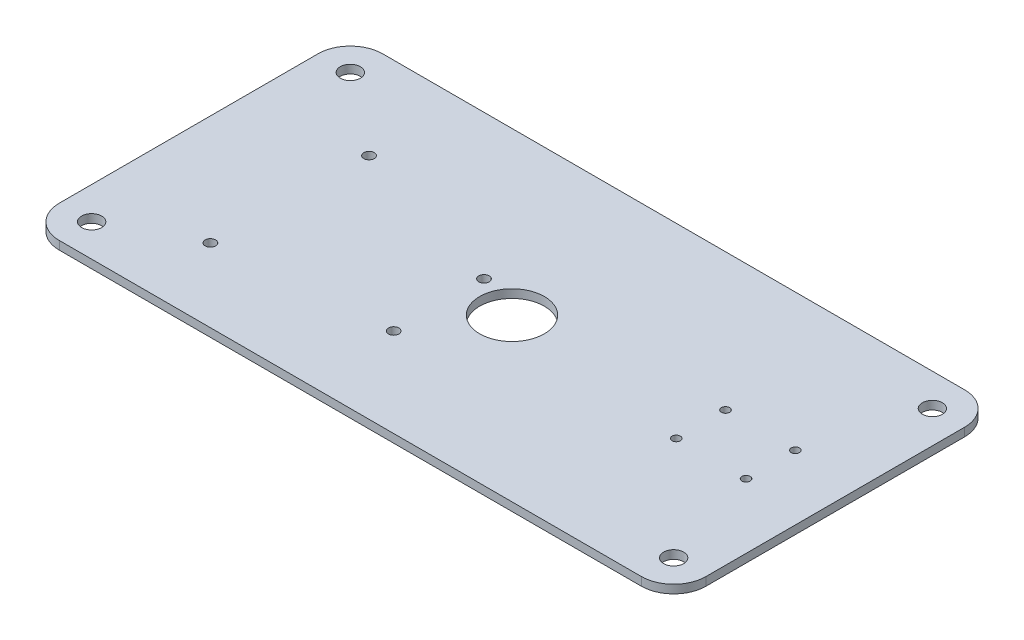
ISO-10303-21;
HEADER;
FILE_DESCRIPTION(('STEP AP214'),'2;1');
FILE_NAME('part.step','',(''),(''),'','','');
FILE_SCHEMA(('AUTOMOTIVE_DESIGN { 1 0 10303 214 1 1 1 1 }'));
ENDSEC;
DATA;
#1=APPLICATION_CONTEXT('core data for automotive mechanical design processes');
#2=APPLICATION_PROTOCOL_DEFINITION('international standard','automotive_design',2000,#1);
#3=PRODUCT_CONTEXT('',#1,'mechanical');
#4=PRODUCT('Part','Part','',(#3));
#5=PRODUCT_RELATED_PRODUCT_CATEGORY('part','',(#4));
#6=PRODUCT_DEFINITION_FORMATION('','',#4);
#7=PRODUCT_DEFINITION_CONTEXT('part definition',#1,'design');
#8=PRODUCT_DEFINITION('design','',#6,#7);
#9=PRODUCT_DEFINITION_SHAPE('','',#8);
#10=(LENGTH_UNIT() NAMED_UNIT(*) SI_UNIT(.MILLI.,.METRE.));
#11=(NAMED_UNIT(*) PLANE_ANGLE_UNIT() SI_UNIT($,.RADIAN.));
#12=(NAMED_UNIT(*) SI_UNIT($,.STERADIAN.) SOLID_ANGLE_UNIT());
#13=UNCERTAINTY_MEASURE_WITH_UNIT(LENGTH_MEASURE(1.E-05),#10,'distance_accuracy_value','');
#14=(GEOMETRIC_REPRESENTATION_CONTEXT(3) GLOBAL_UNCERTAINTY_ASSIGNED_CONTEXT((#13)) GLOBAL_UNIT_ASSIGNED_CONTEXT((#10,
#11,#12)) REPRESENTATION_CONTEXT('',''));
#15=CARTESIAN_POINT('',(0.,0.,0.));
#16=DIRECTION('',(0.,0.,1.));
#17=DIRECTION('',(1.,0.,0.));
#18=AXIS2_PLACEMENT_3D('',#15,#16,#17);
#19=CARTESIAN_POINT('',(0.,2.6,0.));
#20=DIRECTION('',(1.,0.,0.));
#21=DIRECTION('',(0.,0.,-1.));
#22=AXIS2_PLACEMENT_3D('',#19,#20,#21);
#23=PLANE('',#22);
#24=DIRECTION('',(0.,0.,1.));
#25=VECTOR('',#24,1.);
#26=CARTESIAN_POINT('',(0.,2.6,0.));
#27=LINE('',#26,#25);
#28=CARTESIAN_POINT('',(0.,2.6,10.));
#29=VERTEX_POINT('',#28);
#30=CARTESIAN_POINT('',(0.,2.6,90.));
#31=VERTEX_POINT('',#30);
#32=EDGE_CURVE('E121',#29,#31,#27,.T.);
#33=ORIENTED_EDGE('',*,*,#32,.F.);
#34=DIRECTION('',(0.,-1.,0.));
#35=VECTOR('',#34,1.);
#36=CARTESIAN_POINT('',(0.,0.,10.));
#37=LINE('',#36,#35);
#38=CARTESIAN_POINT('',(0.,0.,10.));
#39=VERTEX_POINT('',#38);
#40=EDGE_CURVE('E106',#29,#39,#37,.T.);
#41=ORIENTED_EDGE('',*,*,#40,.T.);
#42=DIRECTION('',(0.,0.,1.));
#43=VECTOR('',#42,1.);
#44=CARTESIAN_POINT('',(0.,0.,0.));
#45=LINE('',#44,#43);
#46=CARTESIAN_POINT('',(0.,0.,90.));
#47=VERTEX_POINT('',#46);
#48=EDGE_CURVE('E118',#39,#47,#45,.T.);
#49=ORIENTED_EDGE('',*,*,#48,.T.);
#50=DIRECTION('',(0.,-1.,0.));
#51=VECTOR('',#50,1.);
#52=CARTESIAN_POINT('',(0.,2.6,90.));
#53=LINE('',#52,#51);
#54=EDGE_CURVE('E123',#47,#31,#53,.F.);
#55=ORIENTED_EDGE('',*,*,#54,.T.);
#56=EDGE_LOOP('',(#33,#41,#49,#55));
#57=FACE_BOUND('',#56,.T.);
#58=ADVANCED_FACE('F35',(#57),#23,.F.);
#59=CARTESIAN_POINT('',(0.,2.6,100.));
#60=DIRECTION('',(0.,0.,-1.));
#61=DIRECTION('',(-1.,0.,0.));
#62=AXIS2_PLACEMENT_3D('',#59,#60,#61);
#63=PLANE('',#62);
#64=DIRECTION('',(1.,0.,0.));
#65=VECTOR('',#64,1.);
#66=CARTESIAN_POINT('',(0.,2.6,100.));
#67=LINE('',#66,#65);
#68=CARTESIAN_POINT('',(10.,2.6,100.));
#69=VERTEX_POINT('',#68);
#70=CARTESIAN_POINT('',(190.,2.6,100.));
#71=VERTEX_POINT('',#70);
#72=EDGE_CURVE('E169',#69,#71,#67,.T.);
#73=ORIENTED_EDGE('',*,*,#72,.F.);
#74=DIRECTION('',(0.,-1.,0.));
#75=VECTOR('',#74,1.);
#76=CARTESIAN_POINT('',(10.,2.6,100.));
#77=LINE('',#76,#75);
#78=CARTESIAN_POINT('',(10.,0.,100.));
#79=VERTEX_POINT('',#78);
#80=EDGE_CURVE('E161',#69,#79,#77,.T.);
#81=ORIENTED_EDGE('',*,*,#80,.T.);
#82=DIRECTION('',(1.,0.,0.));
#83=VECTOR('',#82,1.);
#84=CARTESIAN_POINT('',(0.,0.,100.));
#85=LINE('',#84,#83);
#86=CARTESIAN_POINT('',(190.,0.,100.));
#87=VERTEX_POINT('',#86);
#88=EDGE_CURVE('E127',#79,#87,#85,.T.);
#89=ORIENTED_EDGE('',*,*,#88,.T.);
#90=DIRECTION('',(0.,-1.,0.));
#91=VECTOR('',#90,1.);
#92=CARTESIAN_POINT('',(190.,2.6,100.));
#93=LINE('',#92,#91);
#94=EDGE_CURVE('E159',#87,#71,#93,.F.);
#95=ORIENTED_EDGE('',*,*,#94,.T.);
#96=EDGE_LOOP('',(#73,#81,#89,#95));
#97=FACE_BOUND('',#96,.T.);
#98=ADVANCED_FACE('F167',(#97),#63,.F.);
#99=CARTESIAN_POINT('',(200.,2.6,0.));
#100=DIRECTION('',(1.,0.,0.));
#101=DIRECTION('',(0.,0.,-1.));
#102=AXIS2_PLACEMENT_3D('',#99,#100,#101);
#103=PLANE('',#102);
#104=DIRECTION('',(0.,0.,1.));
#105=VECTOR('',#104,1.);
#106=CARTESIAN_POINT('',(200.,2.6,0.));
#107=LINE('',#106,#105);
#108=CARTESIAN_POINT('',(200.,2.6,10.));
#109=VERTEX_POINT('',#108);
#110=CARTESIAN_POINT('',(200.,2.6,90.));
#111=VERTEX_POINT('',#110);
#112=EDGE_CURVE('E176',#109,#111,#107,.T.);
#113=ORIENTED_EDGE('',*,*,#112,.T.);
#114=DIRECTION('',(0.,-1.,0.));
#115=VECTOR('',#114,1.);
#116=CARTESIAN_POINT('',(200.,0.,90.));
#117=LINE('',#116,#115);
#118=CARTESIAN_POINT('',(200.,0.,90.));
#119=VERTEX_POINT('',#118);
#120=EDGE_CURVE('E11',#111,#119,#117,.T.);
#121=ORIENTED_EDGE('',*,*,#120,.T.);
#122=DIRECTION('',(0.,0.,1.));
#123=VECTOR('',#122,1.);
#124=CARTESIAN_POINT('',(200.,0.,0.));
#125=LINE('',#124,#123);
#126=CARTESIAN_POINT('',(200.,0.,10.));
#127=VERTEX_POINT('',#126);
#128=EDGE_CURVE('E131',#127,#119,#125,.T.);
#129=ORIENTED_EDGE('',*,*,#128,.F.);
#130=DIRECTION('',(0.,-1.,0.));
#131=VECTOR('',#130,1.);
#132=CARTESIAN_POINT('',(200.,2.6,10.));
#133=LINE('',#132,#131);
#134=EDGE_CURVE('E44',#127,#109,#133,.F.);
#135=ORIENTED_EDGE('',*,*,#134,.T.);
#136=EDGE_LOOP('',(#113,#121,#129,#135));
#137=FACE_BOUND('',#136,.T.);
#138=ADVANCED_FACE('F175',(#137),#103,.T.);
#139=CARTESIAN_POINT('',(0.,2.6,0.));
#140=DIRECTION('',(0.,0.,-1.));
#141=DIRECTION('',(-1.,0.,0.));
#142=AXIS2_PLACEMENT_3D('',#139,#140,#141);
#143=PLANE('',#142);
#144=DIRECTION('',(1.,0.,0.));
#145=VECTOR('',#144,1.);
#146=CARTESIAN_POINT('',(0.,0.,0.));
#147=LINE('',#146,#145);
#148=CARTESIAN_POINT('',(10.,0.,0.));
#149=VERTEX_POINT('',#148);
#150=CARTESIAN_POINT('',(190.,0.,0.));
#151=VERTEX_POINT('',#150);
#152=EDGE_CURVE('E142',#149,#151,#147,.T.);
#153=ORIENTED_EDGE('',*,*,#152,.F.);
#154=DIRECTION('',(0.,-1.,0.));
#155=VECTOR('',#154,1.);
#156=CARTESIAN_POINT('',(10.,2.6,0.));
#157=LINE('',#156,#155);
#158=CARTESIAN_POINT('',(10.,2.6,0.));
#159=VERTEX_POINT('',#158);
#160=EDGE_CURVE('E107',#149,#159,#157,.F.);
#161=ORIENTED_EDGE('',*,*,#160,.T.);
#162=DIRECTION('',(1.,0.,0.));
#163=VECTOR('',#162,1.);
#164=CARTESIAN_POINT('',(0.,2.6,0.));
#165=LINE('',#164,#163);
#166=CARTESIAN_POINT('',(190.,2.6,0.));
#167=VERTEX_POINT('',#166);
#168=EDGE_CURVE('E137',#159,#167,#165,.T.);
#169=ORIENTED_EDGE('',*,*,#168,.T.);
#170=DIRECTION('',(0.,-1.,0.));
#171=VECTOR('',#170,1.);
#172=CARTESIAN_POINT('',(190.,2.6,0.));
#173=LINE('',#172,#171);
#174=EDGE_CURVE('E112',#167,#151,#173,.T.);
#175=ORIENTED_EDGE('',*,*,#174,.T.);
#176=EDGE_LOOP('',(#153,#161,#169,#175));
#177=FACE_BOUND('',#176,.T.);
#178=ADVANCED_FACE('F266',(#177),#143,.T.);
#179=CARTESIAN_POINT('',(0.,2.6,0.));
#180=DIRECTION('',(0.,1.,0.));
#181=DIRECTION('',(0.,0.,1.));
#182=AXIS2_PLACEMENT_3D('',#179,#180,#181);
#183=PLANE('',#182);
#184=CARTESIAN_POINT('',(180.,2.6,42.38));
#185=DIRECTION('',(0.,1.,0.));
#186=DIRECTION('',(0.,0.,1.));
#187=AXIS2_PLACEMENT_3D('',#184,#185,#186);
#188=CIRCLE('',#187,1.27);
#189=CARTESIAN_POINT('',(180.,2.6,43.65));
#190=VERTEX_POINT('',#189);
#191=EDGE_CURVE('E248',#190,#190,#188,.T.);
#192=ORIENTED_EDGE('',*,*,#191,.F.);
#193=EDGE_LOOP('',(#192));
#194=FACE_BOUND('',#193,.T.);
#195=CARTESIAN_POINT('',(158.41,2.6,57.62));
#196=DIRECTION('',(0.,1.,0.));
#197=DIRECTION('',(0.,0.,1.));
#198=AXIS2_PLACEMENT_3D('',#195,#196,#197);
#199=CIRCLE('',#198,1.27);
#200=CARTESIAN_POINT('',(158.41,2.6,58.89));
#201=VERTEX_POINT('',#200);
#202=EDGE_CURVE('E242',#201,#201,#199,.T.);
#203=ORIENTED_EDGE('',*,*,#202,.F.);
#204=EDGE_LOOP('',(#203));
#205=FACE_BOUND('',#204,.T.);
#206=CARTESIAN_POINT('',(180.,2.6,57.62));
#207=DIRECTION('',(0.,1.,0.));
#208=DIRECTION('',(0.,0.,1.));
#209=AXIS2_PLACEMENT_3D('',#206,#207,#208);
#210=CIRCLE('',#209,1.27);
#211=CARTESIAN_POINT('',(180.,2.6,58.89));
#212=VERTEX_POINT('',#211);
#213=EDGE_CURVE('E236',#212,#212,#210,.T.);
#214=ORIENTED_EDGE('',*,*,#213,.F.);
#215=EDGE_LOOP('',(#214));
#216=FACE_BOUND('',#215,.T.);
#217=CARTESIAN_POINT('',(158.41,2.6,42.38));
#218=DIRECTION('',(0.,1.,0.));
#219=DIRECTION('',(0.,0.,1.));
#220=AXIS2_PLACEMENT_3D('',#217,#218,#219);
#221=CIRCLE('',#220,1.27);
#222=CARTESIAN_POINT('',(158.41,2.6,43.65));
#223=VERTEX_POINT('',#222);
#224=EDGE_CURVE('E230',#223,#223,#221,.T.);
#225=ORIENTED_EDGE('',*,*,#224,.F.);
#226=EDGE_LOOP('',(#225));
#227=FACE_BOUND('',#226,.T.);
#228=CARTESIAN_POINT('',(100.,2.6,50.));
#229=DIRECTION('',(0.,-1.,0.));
#230=DIRECTION('',(0.,0.,-1.));
#231=AXIS2_PLACEMENT_3D('',#228,#229,#230);
#232=CIRCLE('',#231,9.99999999999999);
#233=CARTESIAN_POINT('',(100.,2.6,40.));
#234=VERTEX_POINT('',#233);
#235=EDGE_CURVE('E221',#234,#234,#232,.T.);
#236=ORIENTED_EDGE('',*,*,#235,.T.);
#237=EDGE_LOOP('',(#236));
#238=FACE_BOUND('',#237,.T.);
#239=CARTESIAN_POINT('',(85.94475,2.6,72.53875));
#240=DIRECTION('',(0.,1.,0.));
#241=DIRECTION('',(0.,0.,1.));
#242=AXIS2_PLACEMENT_3D('',#239,#240,#241);
#243=CIRCLE('',#242,1.61925);
#244=CARTESIAN_POINT('',(85.94475,2.6,74.158));
#245=VERTEX_POINT('',#244);
#246=EDGE_CURVE('E218',#245,#245,#243,.T.);
#247=ORIENTED_EDGE('',*,*,#246,.F.);
#248=EDGE_LOOP('',(#247));
#249=FACE_BOUND('',#248,.T.);
#250=CARTESIAN_POINT('',(34.01445,2.6,77.28855));
#251=DIRECTION('',(0.,1.,0.));
#252=DIRECTION('',(0.,0.,1.));
#253=AXIS2_PLACEMENT_3D('',#250,#251,#252);
#254=CIRCLE('',#253,1.61925);
#255=CARTESIAN_POINT('',(34.01445,2.6,78.9078));
#256=VERTEX_POINT('',#255);
#257=EDGE_CURVE('E212',#256,#256,#254,.T.);
#258=ORIENTED_EDGE('',*,*,#257,.F.);
#259=EDGE_LOOP('',(#258));
#260=FACE_BOUND('',#259,.T.);
#261=CARTESIAN_POINT('',(85.94475,2.6,44.61145));
#262=DIRECTION('',(0.,1.,0.));
#263=DIRECTION('',(0.,0.,1.));
#264=AXIS2_PLACEMENT_3D('',#261,#262,#263);
#265=CIRCLE('',#264,1.61925);
#266=CARTESIAN_POINT('',(85.94475,2.6,46.2307));
#267=VERTEX_POINT('',#266);
#268=EDGE_CURVE('E206',#267,#267,#265,.T.);
#269=ORIENTED_EDGE('',*,*,#268,.F.);
#270=EDGE_LOOP('',(#269));
#271=FACE_BOUND('',#270,.T.);
#272=CARTESIAN_POINT('',(35.15745,2.6,29.37145));
#273=DIRECTION('',(0.,1.,0.));
#274=DIRECTION('',(0.,0.,1.));
#275=AXIS2_PLACEMENT_3D('',#272,#273,#274);
#276=CIRCLE('',#275,1.61924999999999);
#277=CARTESIAN_POINT('',(35.15745,2.6,30.9907));
#278=VERTEX_POINT('',#277);
#279=EDGE_CURVE('E202',#278,#278,#276,.T.);
#280=ORIENTED_EDGE('',*,*,#279,.F.);
#281=EDGE_LOOP('',(#280));
#282=FACE_BOUND('',#281,.T.);
#283=CARTESIAN_POINT('',(190.,2.6,90.));
#284=DIRECTION('',(0.,1.,0.));
#285=DIRECTION('',(0.,0.,1.));
#286=AXIS2_PLACEMENT_3D('',#283,#284,#285);
#287=CIRCLE('',#286,3.09999999999999);
#288=CARTESIAN_POINT('',(190.,2.6,93.1));
#289=VERTEX_POINT('',#288);
#290=EDGE_CURVE('E194',#289,#289,#287,.T.);
#291=ORIENTED_EDGE('',*,*,#290,.F.);
#292=EDGE_LOOP('',(#291));
#293=FACE_BOUND('',#292,.T.);
#294=CARTESIAN_POINT('',(10.,2.6,90.));
#295=DIRECTION('',(0.,-1.,0.));
#296=DIRECTION('',(0.,0.,1.));
#297=AXIS2_PLACEMENT_3D('',#294,#295,#296);
#298=CIRCLE('',#297,3.09999999999999);
#299=CARTESIAN_POINT('',(10.,2.6,93.1));
#300=VERTEX_POINT('',#299);
#301=EDGE_CURVE('E188',#300,#300,#298,.T.);
#302=ORIENTED_EDGE('',*,*,#301,.T.);
#303=EDGE_LOOP('',(#302));
#304=FACE_BOUND('',#303,.T.);
#305=CARTESIAN_POINT('',(10.,2.6,10.));
#306=DIRECTION('',(0.,1.,0.));
#307=DIRECTION('',(0.,0.,-1.));
#308=AXIS2_PLACEMENT_3D('',#305,#306,#307);
#309=CIRCLE('',#308,3.09999999999999);
#310=CARTESIAN_POINT('',(10.,2.6,6.90000000000002));
#311=VERTEX_POINT('',#310);
#312=EDGE_CURVE('E183',#311,#311,#309,.T.);
#313=ORIENTED_EDGE('',*,*,#312,.F.);
#314=EDGE_LOOP('',(#313));
#315=FACE_BOUND('',#314,.T.);
#316=CARTESIAN_POINT('',(190.,2.6,10.));
#317=DIRECTION('',(0.,-1.,0.));
#318=DIRECTION('',(0.,0.,-1.));
#319=AXIS2_PLACEMENT_3D('',#316,#317,#318);
#320=CIRCLE('',#319,3.09999999999999);
#321=CARTESIAN_POINT('',(190.,2.6,6.90000000000001));
#322=VERTEX_POINT('',#321);
#323=EDGE_CURVE('E128',#322,#322,#320,.T.);
#324=ORIENTED_EDGE('',*,*,#323,.T.);
#325=EDGE_LOOP('',(#324));
#326=FACE_BOUND('',#325,.T.);
#327=ORIENTED_EDGE('',*,*,#168,.F.);
#328=CARTESIAN_POINT('',(10.,2.6,10.));
#329=DIRECTION('',(0.,1.,0.));
#330=DIRECTION('',(0.,0.,1.));
#331=AXIS2_PLACEMENT_3D('',#328,#329,#330);
#332=CIRCLE('',#331,10.);
#333=EDGE_CURVE('E157',#159,#29,#332,.T.);
#334=ORIENTED_EDGE('',*,*,#333,.T.);
#335=ORIENTED_EDGE('',*,*,#32,.T.);
#336=CARTESIAN_POINT('',(10.,2.6,90.));
#337=DIRECTION('',(0.,1.,0.));
#338=DIRECTION('',(0.,0.,1.));
#339=AXIS2_PLACEMENT_3D('',#336,#337,#338);
#340=CIRCLE('',#339,10.);
#341=EDGE_CURVE('E155',#31,#69,#340,.T.);
#342=ORIENTED_EDGE('',*,*,#341,.T.);
#343=ORIENTED_EDGE('',*,*,#72,.T.);
#344=CARTESIAN_POINT('',(190.,2.6,90.));
#345=DIRECTION('',(0.,1.,0.));
#346=DIRECTION('',(0.,0.,1.));
#347=AXIS2_PLACEMENT_3D('',#344,#345,#346);
#348=CIRCLE('',#347,10.);
#349=EDGE_CURVE('E51',#71,#111,#348,.T.);
#350=ORIENTED_EDGE('',*,*,#349,.T.);
#351=ORIENTED_EDGE('',*,*,#112,.F.);
#352=CARTESIAN_POINT('',(190.,2.6,10.));
#353=DIRECTION('',(0.,1.,0.));
#354=DIRECTION('',(0.,0.,1.));
#355=AXIS2_PLACEMENT_3D('',#352,#353,#354);
#356=CIRCLE('',#355,10.);
#357=EDGE_CURVE('E152',#109,#167,#356,.T.);
#358=ORIENTED_EDGE('',*,*,#357,.T.);
#359=EDGE_LOOP('',(#327,#334,#335,#342,#343,#350,#351,#358));
#360=FACE_BOUND('',#359,.T.);
#361=ADVANCED_FACE('F263',(#194,#205,#216,#227,#238,#249,#260,#271,#282,#293,#304,#315,#326,
#360),#183,.T.);
#362=CARTESIAN_POINT('',(0.,0.,0.));
#363=DIRECTION('',(0.,1.,0.));
#364=DIRECTION('',(0.,0.,1.));
#365=AXIS2_PLACEMENT_3D('',#362,#363,#364);
#366=PLANE('',#365);
#367=CARTESIAN_POINT('',(180.,0.,42.38));
#368=DIRECTION('',(0.,1.,0.));
#369=DIRECTION('',(0.,0.,1.));
#370=AXIS2_PLACEMENT_3D('',#367,#368,#369);
#371=CIRCLE('',#370,1.27);
#372=CARTESIAN_POINT('',(180.,0.,43.65));
#373=VERTEX_POINT('',#372);
#374=EDGE_CURVE('E233',#373,#373,#371,.T.);
#375=ORIENTED_EDGE('',*,*,#374,.T.);
#376=EDGE_LOOP('',(#375));
#377=FACE_BOUND('',#376,.T.);
#378=CARTESIAN_POINT('',(158.41,0.,57.62));
#379=DIRECTION('',(0.,1.,0.));
#380=DIRECTION('',(0.,0.,1.));
#381=AXIS2_PLACEMENT_3D('',#378,#379,#380);
#382=CIRCLE('',#381,1.27);
#383=CARTESIAN_POINT('',(158.41,0.,58.89));
#384=VERTEX_POINT('',#383);
#385=EDGE_CURVE('E245',#384,#384,#382,.T.);
#386=ORIENTED_EDGE('',*,*,#385,.T.);
#387=EDGE_LOOP('',(#386));
#388=FACE_BOUND('',#387,.T.);
#389=CARTESIAN_POINT('',(180.,0.,57.62));
#390=DIRECTION('',(0.,1.,0.));
#391=DIRECTION('',(0.,0.,1.));
#392=AXIS2_PLACEMENT_3D('',#389,#390,#391);
#393=CIRCLE('',#392,1.27);
#394=CARTESIAN_POINT('',(180.,0.,58.89));
#395=VERTEX_POINT('',#394);
#396=EDGE_CURVE('E239',#395,#395,#393,.T.);
#397=ORIENTED_EDGE('',*,*,#396,.T.);
#398=EDGE_LOOP('',(#397));
#399=FACE_BOUND('',#398,.T.);
#400=CARTESIAN_POINT('',(158.41,0.,42.38));
#401=DIRECTION('',(0.,1.,0.));
#402=DIRECTION('',(0.,0.,1.));
#403=AXIS2_PLACEMENT_3D('',#400,#401,#402);
#404=CIRCLE('',#403,1.27);
#405=CARTESIAN_POINT('',(158.41,0.,43.65));
#406=VERTEX_POINT('',#405);
#407=EDGE_CURVE('E227',#406,#406,#404,.T.);
#408=ORIENTED_EDGE('',*,*,#407,.T.);
#409=EDGE_LOOP('',(#408));
#410=FACE_BOUND('',#409,.T.);
#411=CARTESIAN_POINT('',(100.,0.,50.));
#412=DIRECTION('',(0.,-1.,0.));
#413=DIRECTION('',(0.,0.,-1.));
#414=AXIS2_PLACEMENT_3D('',#411,#412,#413);
#415=CIRCLE('',#414,9.99999999999999);
#416=CARTESIAN_POINT('',(100.,0.,40.));
#417=VERTEX_POINT('',#416);
#418=EDGE_CURVE('E224',#417,#417,#415,.T.);
#419=ORIENTED_EDGE('',*,*,#418,.F.);
#420=EDGE_LOOP('',(#419));
#421=FACE_BOUND('',#420,.T.);
#422=CARTESIAN_POINT('',(85.94475,0.,72.53875));
#423=DIRECTION('',(0.,1.,0.));
#424=DIRECTION('',(0.,0.,1.));
#425=AXIS2_PLACEMENT_3D('',#422,#423,#424);
#426=CIRCLE('',#425,1.61925);
#427=CARTESIAN_POINT('',(85.94475,0.,74.158));
#428=VERTEX_POINT('',#427);
#429=EDGE_CURVE('E215',#428,#428,#426,.T.);
#430=ORIENTED_EDGE('',*,*,#429,.T.);
#431=EDGE_LOOP('',(#430));
#432=FACE_BOUND('',#431,.T.);
#433=CARTESIAN_POINT('',(34.01445,0.,77.28855));
#434=DIRECTION('',(0.,1.,0.));
#435=DIRECTION('',(0.,0.,1.));
#436=AXIS2_PLACEMENT_3D('',#433,#434,#435);
#437=CIRCLE('',#436,1.61925);
#438=CARTESIAN_POINT('',(34.01445,0.,78.9078));
#439=VERTEX_POINT('',#438);
#440=EDGE_CURVE('E209',#439,#439,#437,.T.);
#441=ORIENTED_EDGE('',*,*,#440,.T.);
#442=EDGE_LOOP('',(#441));
#443=FACE_BOUND('',#442,.T.);
#444=CARTESIAN_POINT('',(85.94475,0.,44.61145));
#445=DIRECTION('',(0.,1.,0.));
#446=DIRECTION('',(0.,0.,1.));
#447=AXIS2_PLACEMENT_3D('',#444,#445,#446);
#448=CIRCLE('',#447,1.61925);
#449=CARTESIAN_POINT('',(85.94475,0.,46.2307));
#450=VERTEX_POINT('',#449);
#451=EDGE_CURVE('E205',#450,#450,#448,.T.);
#452=ORIENTED_EDGE('',*,*,#451,.T.);
#453=EDGE_LOOP('',(#452));
#454=FACE_BOUND('',#453,.T.);
#455=CARTESIAN_POINT('',(35.15745,0.,29.37145));
#456=DIRECTION('',(0.,1.,0.));
#457=DIRECTION('',(0.,0.,1.));
#458=AXIS2_PLACEMENT_3D('',#455,#456,#457);
#459=CIRCLE('',#458,1.61924999999999);
#460=CARTESIAN_POINT('',(35.15745,0.,30.9907));
#461=VERTEX_POINT('',#460);
#462=EDGE_CURVE('E39',#461,#461,#459,.T.);
#463=ORIENTED_EDGE('',*,*,#462,.T.);
#464=EDGE_LOOP('',(#463));
#465=FACE_BOUND('',#464,.T.);
#466=CARTESIAN_POINT('',(190.,0.,90.));
#467=DIRECTION('',(0.,1.,0.));
#468=DIRECTION('',(0.,0.,1.));
#469=AXIS2_PLACEMENT_3D('',#466,#467,#468);
#470=CIRCLE('',#469,3.09999999999999);
#471=CARTESIAN_POINT('',(190.,0.,93.1));
#472=VERTEX_POINT('',#471);
#473=EDGE_CURVE('E197',#472,#472,#470,.T.);
#474=ORIENTED_EDGE('',*,*,#473,.T.);
#475=EDGE_LOOP('',(#474));
#476=FACE_BOUND('',#475,.T.);
#477=CARTESIAN_POINT('',(10.,0.,90.));
#478=DIRECTION('',(0.,-1.,0.));
#479=DIRECTION('',(0.,0.,1.));
#480=AXIS2_PLACEMENT_3D('',#477,#478,#479);
#481=CIRCLE('',#480,3.09999999999999);
#482=CARTESIAN_POINT('',(10.,0.,93.1));
#483=VERTEX_POINT('',#482);
#484=EDGE_CURVE('E191',#483,#483,#481,.T.);
#485=ORIENTED_EDGE('',*,*,#484,.F.);
#486=EDGE_LOOP('',(#485));
#487=FACE_BOUND('',#486,.T.);
#488=CARTESIAN_POINT('',(10.,0.,10.));
#489=DIRECTION('',(0.,1.,0.));
#490=DIRECTION('',(0.,0.,-1.));
#491=AXIS2_PLACEMENT_3D('',#488,#489,#490);
#492=CIRCLE('',#491,3.09999999999999);
#493=CARTESIAN_POINT('',(10.,0.,6.90000000000002));
#494=VERTEX_POINT('',#493);
#495=EDGE_CURVE('E185',#494,#494,#492,.T.);
#496=ORIENTED_EDGE('',*,*,#495,.T.);
#497=EDGE_LOOP('',(#496));
#498=FACE_BOUND('',#497,.T.);
#499=CARTESIAN_POINT('',(190.,0.,10.));
#500=DIRECTION('',(0.,-1.,0.));
#501=DIRECTION('',(0.,0.,-1.));
#502=AXIS2_PLACEMENT_3D('',#499,#500,#501);
#503=CIRCLE('',#502,3.09999999999999);
#504=CARTESIAN_POINT('',(190.,0.,6.90000000000001));
#505=VERTEX_POINT('',#504);
#506=EDGE_CURVE('E134',#505,#505,#503,.T.);
#507=ORIENTED_EDGE('',*,*,#506,.F.);
#508=EDGE_LOOP('',(#507));
#509=FACE_BOUND('',#508,.T.);
#510=ORIENTED_EDGE('',*,*,#48,.F.);
#511=CARTESIAN_POINT('',(10.,0.,10.));
#512=DIRECTION('',(0.,1.,0.));
#513=DIRECTION('',(0.,0.,1.));
#514=AXIS2_PLACEMENT_3D('',#511,#512,#513);
#515=CIRCLE('',#514,10.);
#516=EDGE_CURVE('E102',#39,#149,#515,.F.);
#517=ORIENTED_EDGE('',*,*,#516,.T.);
#518=ORIENTED_EDGE('',*,*,#152,.T.);
#519=CARTESIAN_POINT('',(190.,0.,10.));
#520=DIRECTION('',(0.,1.,0.));
#521=DIRECTION('',(0.,0.,1.));
#522=AXIS2_PLACEMENT_3D('',#519,#520,#521);
#523=CIRCLE('',#522,10.);
#524=EDGE_CURVE('E122',#151,#127,#523,.F.);
#525=ORIENTED_EDGE('',*,*,#524,.T.);
#526=ORIENTED_EDGE('',*,*,#128,.T.);
#527=CARTESIAN_POINT('',(190.,0.,90.));
#528=DIRECTION('',(0.,1.,0.));
#529=DIRECTION('',(0.,0.,1.));
#530=AXIS2_PLACEMENT_3D('',#527,#528,#529);
#531=CIRCLE('',#530,10.);
#532=EDGE_CURVE('E146',#119,#87,#531,.F.);
#533=ORIENTED_EDGE('',*,*,#532,.T.);
#534=ORIENTED_EDGE('',*,*,#88,.F.);
#535=CARTESIAN_POINT('',(10.,0.,90.));
#536=DIRECTION('',(0.,1.,0.));
#537=DIRECTION('',(0.,0.,1.));
#538=AXIS2_PLACEMENT_3D('',#535,#536,#537);
#539=CIRCLE('',#538,10.);
#540=EDGE_CURVE('E113',#79,#47,#539,.F.);
#541=ORIENTED_EDGE('',*,*,#540,.T.);
#542=EDGE_LOOP('',(#510,#517,#518,#525,#526,#533,#534,#541));
#543=FACE_BOUND('',#542,.T.);
#544=ADVANCED_FACE('F125',(#377,#388,#399,#410,#421,#432,#443,#454,#465,#476,#487,#498,#509,
#543),#366,.F.);
#545=CARTESIAN_POINT('',(10.,2.6,10.));
#546=DIRECTION('',(0.,1.,0.));
#547=DIRECTION('',(0.,0.,1.));
#548=AXIS2_PLACEMENT_3D('',#545,#546,#547);
#549=CYLINDRICAL_SURFACE('',#548,10.);
#550=ORIENTED_EDGE('',*,*,#333,.F.);
#551=ORIENTED_EDGE('',*,*,#160,.F.);
#552=ORIENTED_EDGE('',*,*,#516,.F.);
#553=ORIENTED_EDGE('',*,*,#40,.F.);
#554=EDGE_LOOP('',(#550,#551,#552,#553));
#555=FACE_BOUND('',#554,.T.);
#556=ADVANCED_FACE('F105',(#555),#549,.T.);
#557=CARTESIAN_POINT('',(10.,2.6,90.));
#558=DIRECTION('',(0.,-1.,0.));
#559=DIRECTION('',(0.,0.,-1.));
#560=AXIS2_PLACEMENT_3D('',#557,#558,#559);
#561=CYLINDRICAL_SURFACE('',#560,10.);
#562=ORIENTED_EDGE('',*,*,#341,.F.);
#563=ORIENTED_EDGE('',*,*,#54,.F.);
#564=ORIENTED_EDGE('',*,*,#540,.F.);
#565=ORIENTED_EDGE('',*,*,#80,.F.);
#566=EDGE_LOOP('',(#562,#563,#564,#565));
#567=FACE_BOUND('',#566,.T.);
#568=ADVANCED_FACE('F304',(#567),#561,.T.);
#569=CARTESIAN_POINT('',(190.,2.6,90.));
#570=DIRECTION('',(0.,1.,0.));
#571=DIRECTION('',(0.,0.,1.));
#572=AXIS2_PLACEMENT_3D('',#569,#570,#571);
#573=CYLINDRICAL_SURFACE('',#572,10.);
#574=ORIENTED_EDGE('',*,*,#349,.F.);
#575=ORIENTED_EDGE('',*,*,#94,.F.);
#576=ORIENTED_EDGE('',*,*,#532,.F.);
#577=ORIENTED_EDGE('',*,*,#120,.F.);
#578=EDGE_LOOP('',(#574,#575,#576,#577));
#579=FACE_BOUND('',#578,.T.);
#580=ADVANCED_FACE('F174',(#579),#573,.T.);
#581=CARTESIAN_POINT('',(190.,2.6,10.));
#582=DIRECTION('',(0.,-1.,0.));
#583=DIRECTION('',(0.,0.,-1.));
#584=AXIS2_PLACEMENT_3D('',#581,#582,#583);
#585=CYLINDRICAL_SURFACE('',#584,10.);
#586=ORIENTED_EDGE('',*,*,#357,.F.);
#587=ORIENTED_EDGE('',*,*,#134,.F.);
#588=ORIENTED_EDGE('',*,*,#524,.F.);
#589=ORIENTED_EDGE('',*,*,#174,.F.);
#590=EDGE_LOOP('',(#586,#587,#588,#589));
#591=FACE_BOUND('',#590,.T.);
#592=ADVANCED_FACE('F37',(#591),#585,.T.);
#593=CARTESIAN_POINT('',(190.,2.6,10.));
#594=DIRECTION('',(0.,-1.,0.));
#595=DIRECTION('',(0.,0.,-1.));
#596=AXIS2_PLACEMENT_3D('',#593,#594,#595);
#597=CYLINDRICAL_SURFACE('',#596,3.09999999999999);
#598=ORIENTED_EDGE('',*,*,#323,.F.);
#599=EDGE_LOOP('',(#598));
#600=FACE_BOUND('',#599,.T.);
#601=ORIENTED_EDGE('',*,*,#506,.T.);
#602=EDGE_LOOP('',(#601));
#603=FACE_BOUND('',#602,.T.);
#604=ADVANCED_FACE('F296',(#600,#603),#597,.F.);
#605=CARTESIAN_POINT('',(10.,2.6,10.));
#606=DIRECTION('',(0.,-1.,0.));
#607=DIRECTION('',(0.,0.,-1.));
#608=AXIS2_PLACEMENT_3D('',#605,#606,#607);
#609=CYLINDRICAL_SURFACE('',#608,3.09999999999999);
#610=ORIENTED_EDGE('',*,*,#312,.T.);
#611=EDGE_LOOP('',(#610));
#612=FACE_BOUND('',#611,.T.);
#613=ORIENTED_EDGE('',*,*,#495,.F.);
#614=EDGE_LOOP('',(#613));
#615=FACE_BOUND('',#614,.T.);
#616=ADVANCED_FACE('F301',(#612,#615),#609,.F.);
#617=CARTESIAN_POINT('',(10.,2.6,90.));
#618=DIRECTION('',(0.,-1.,0.));
#619=DIRECTION('',(0.,0.,-1.));
#620=AXIS2_PLACEMENT_3D('',#617,#618,#619);
#621=CYLINDRICAL_SURFACE('',#620,3.09999999999999);
#622=ORIENTED_EDGE('',*,*,#301,.F.);
#623=EDGE_LOOP('',(#622));
#624=FACE_BOUND('',#623,.T.);
#625=ORIENTED_EDGE('',*,*,#484,.T.);
#626=EDGE_LOOP('',(#625));
#627=FACE_BOUND('',#626,.T.);
#628=ADVANCED_FACE('F344',(#624,#627),#621,.F.);
#629=CARTESIAN_POINT('',(190.,2.6,90.));
#630=DIRECTION('',(0.,-1.,0.));
#631=DIRECTION('',(0.,0.,-1.));
#632=AXIS2_PLACEMENT_3D('',#629,#630,#631);
#633=CYLINDRICAL_SURFACE('',#632,3.09999999999999);
#634=ORIENTED_EDGE('',*,*,#290,.T.);
#635=EDGE_LOOP('',(#634));
#636=FACE_BOUND('',#635,.T.);
#637=ORIENTED_EDGE('',*,*,#473,.F.);
#638=EDGE_LOOP('',(#637));
#639=FACE_BOUND('',#638,.T.);
#640=ADVANCED_FACE('F354',(#636,#639),#633,.F.);
#641=CARTESIAN_POINT('',(35.15745,-7.4,29.37145));
#642=DIRECTION('',(0.,1.,0.));
#643=DIRECTION('',(0.,0.,1.));
#644=AXIS2_PLACEMENT_3D('',#641,#642,#643);
#645=CYLINDRICAL_SURFACE('',#644,1.61924999999999);
#646=ORIENTED_EDGE('',*,*,#279,.T.);
#647=EDGE_LOOP('',(#646));
#648=FACE_BOUND('',#647,.T.);
#649=ORIENTED_EDGE('',*,*,#462,.F.);
#650=EDGE_LOOP('',(#649));
#651=FACE_BOUND('',#650,.T.);
#652=ADVANCED_FACE('F364',(#648,#651),#645,.F.);
#653=CARTESIAN_POINT('',(85.94475,0.,44.61145));
#654=DIRECTION('',(0.,1.,0.));
#655=DIRECTION('',(0.,0.,1.));
#656=AXIS2_PLACEMENT_3D('',#653,#654,#655);
#657=CYLINDRICAL_SURFACE('',#656,1.61925);
#658=ORIENTED_EDGE('',*,*,#451,.F.);
#659=EDGE_LOOP('',(#658));
#660=FACE_BOUND('',#659,.T.);
#661=ORIENTED_EDGE('',*,*,#268,.T.);
#662=EDGE_LOOP('',(#661));
#663=FACE_BOUND('',#662,.T.);
#664=ADVANCED_FACE('F374',(#660,#663),#657,.F.);
#665=CARTESIAN_POINT('',(34.01445,0.,77.28855));
#666=DIRECTION('',(0.,1.,0.));
#667=DIRECTION('',(0.,0.,1.));
#668=AXIS2_PLACEMENT_3D('',#665,#666,#667);
#669=CYLINDRICAL_SURFACE('',#668,1.61925);
#670=ORIENTED_EDGE('',*,*,#440,.F.);
#671=EDGE_LOOP('',(#670));
#672=FACE_BOUND('',#671,.T.);
#673=ORIENTED_EDGE('',*,*,#257,.T.);
#674=EDGE_LOOP('',(#673));
#675=FACE_BOUND('',#674,.T.);
#676=ADVANCED_FACE('F384',(#672,#675),#669,.F.);
#677=CARTESIAN_POINT('',(85.94475,0.,72.53875));
#678=DIRECTION('',(0.,1.,0.));
#679=DIRECTION('',(0.,0.,1.));
#680=AXIS2_PLACEMENT_3D('',#677,#678,#679);
#681=CYLINDRICAL_SURFACE('',#680,1.61925);
#682=ORIENTED_EDGE('',*,*,#429,.F.);
#683=EDGE_LOOP('',(#682));
#684=FACE_BOUND('',#683,.T.);
#685=ORIENTED_EDGE('',*,*,#246,.T.);
#686=EDGE_LOOP('',(#685));
#687=FACE_BOUND('',#686,.T.);
#688=ADVANCED_FACE('F394',(#684,#687),#681,.F.);
#689=CARTESIAN_POINT('',(100.,2.6,50.));
#690=DIRECTION('',(0.,-1.,0.));
#691=DIRECTION('',(0.,0.,-1.));
#692=AXIS2_PLACEMENT_3D('',#689,#690,#691);
#693=CYLINDRICAL_SURFACE('',#692,9.99999999999999);
#694=ORIENTED_EDGE('',*,*,#235,.F.);
#695=EDGE_LOOP('',(#694));
#696=FACE_BOUND('',#695,.T.);
#697=ORIENTED_EDGE('',*,*,#418,.T.);
#698=EDGE_LOOP('',(#697));
#699=FACE_BOUND('',#698,.T.);
#700=ADVANCED_FACE('F404',(#696,#699),#693,.F.);
#701=CARTESIAN_POINT('',(158.41,0.,42.38));
#702=DIRECTION('',(0.,1.,0.));
#703=DIRECTION('',(0.,0.,1.));
#704=AXIS2_PLACEMENT_3D('',#701,#702,#703);
#705=CYLINDRICAL_SURFACE('',#704,1.27);
#706=ORIENTED_EDGE('',*,*,#407,.F.);
#707=EDGE_LOOP('',(#706));
#708=FACE_BOUND('',#707,.T.);
#709=ORIENTED_EDGE('',*,*,#224,.T.);
#710=EDGE_LOOP('',(#709));
#711=FACE_BOUND('',#710,.T.);
#712=ADVANCED_FACE('F413',(#708,#711),#705,.F.);
#713=CARTESIAN_POINT('',(180.,0.,57.62));
#714=DIRECTION('',(0.,1.,0.));
#715=DIRECTION('',(0.,0.,1.));
#716=AXIS2_PLACEMENT_3D('',#713,#714,#715);
#717=CYLINDRICAL_SURFACE('',#716,1.27);
#718=ORIENTED_EDGE('',*,*,#396,.F.);
#719=EDGE_LOOP('',(#718));
#720=FACE_BOUND('',#719,.T.);
#721=ORIENTED_EDGE('',*,*,#213,.T.);
#722=EDGE_LOOP('',(#721));
#723=FACE_BOUND('',#722,.T.);
#724=ADVANCED_FACE('F434',(#720,#723),#717,.F.);
#725=CARTESIAN_POINT('',(158.41,0.,57.62));
#726=DIRECTION('',(0.,1.,0.));
#727=DIRECTION('',(0.,0.,1.));
#728=AXIS2_PLACEMENT_3D('',#725,#726,#727);
#729=CYLINDRICAL_SURFACE('',#728,1.27);
#730=ORIENTED_EDGE('',*,*,#385,.F.);
#731=EDGE_LOOP('',(#730));
#732=FACE_BOUND('',#731,.T.);
#733=ORIENTED_EDGE('',*,*,#202,.T.);
#734=EDGE_LOOP('',(#733));
#735=FACE_BOUND('',#734,.T.);
#736=ADVANCED_FACE('F259',(#732,#735),#729,.F.);
#737=CARTESIAN_POINT('',(180.,0.,42.38));
#738=DIRECTION('',(0.,1.,0.));
#739=DIRECTION('',(0.,0.,1.));
#740=AXIS2_PLACEMENT_3D('',#737,#738,#739);
#741=CYLINDRICAL_SURFACE('',#740,1.27);
#742=ORIENTED_EDGE('',*,*,#374,.F.);
#743=EDGE_LOOP('',(#742));
#744=FACE_BOUND('',#743,.T.);
#745=ORIENTED_EDGE('',*,*,#191,.T.);
#746=EDGE_LOOP('',(#745));
#747=FACE_BOUND('',#746,.T.);
#748=ADVANCED_FACE('F256',(#744,#747),#741,.F.);
#749=CLOSED_SHELL('',(#58,#98,#138,#178,#361,#544,#556,#568,#580,#592,#604,#616,#628,#640,#652,
#664,#676,#688,#700,#712,#724,#736,#748));
#750=MANIFOLD_SOLID_BREP('B2',#749);
#751=ADVANCED_BREP_SHAPE_REPRESENTATION('',(#18,#750),#14);
#752=SHAPE_DEFINITION_REPRESENTATION(#9,#751);
ENDSEC;
END-ISO-10303-21;
